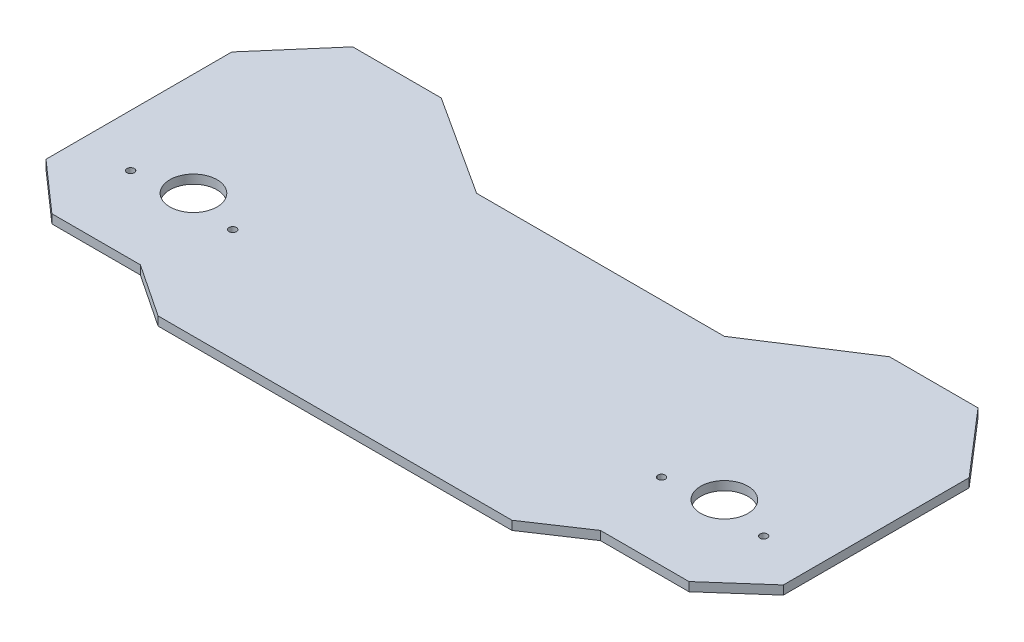
ISO-10303-21;
HEADER;
FILE_DESCRIPTION(('STEP AP214'),'2;1');
FILE_NAME('part.step','',(''),(''),'','','');
FILE_SCHEMA(('AUTOMOTIVE_DESIGN { 1 0 10303 214 1 1 1 1 }'));
ENDSEC;
DATA;
#1=APPLICATION_CONTEXT('core data for automotive mechanical design processes');
#2=APPLICATION_PROTOCOL_DEFINITION('international standard','automotive_design',2000,#1);
#3=PRODUCT_CONTEXT('',#1,'mechanical');
#4=PRODUCT('Part','Part','',(#3));
#5=PRODUCT_RELATED_PRODUCT_CATEGORY('part','',(#4));
#6=PRODUCT_DEFINITION_FORMATION('','',#4);
#7=PRODUCT_DEFINITION_CONTEXT('part definition',#1,'design');
#8=PRODUCT_DEFINITION('design','',#6,#7);
#9=PRODUCT_DEFINITION_SHAPE('','',#8);
#10=(LENGTH_UNIT() NAMED_UNIT(*) SI_UNIT(.MILLI.,.METRE.));
#11=(NAMED_UNIT(*) PLANE_ANGLE_UNIT() SI_UNIT($,.RADIAN.));
#12=(NAMED_UNIT(*) SI_UNIT($,.STERADIAN.) SOLID_ANGLE_UNIT());
#13=UNCERTAINTY_MEASURE_WITH_UNIT(LENGTH_MEASURE(1.E-05),#10,'distance_accuracy_value','');
#14=(GEOMETRIC_REPRESENTATION_CONTEXT(3) GLOBAL_UNCERTAINTY_ASSIGNED_CONTEXT((#13)) GLOBAL_UNIT_ASSIGNED_CONTEXT((#10,
#11,#12)) REPRESENTATION_CONTEXT('',''));
#15=CARTESIAN_POINT('',(0.,0.,0.));
#16=DIRECTION('',(0.,0.,1.));
#17=DIRECTION('',(1.,0.,0.));
#18=AXIS2_PLACEMENT_3D('',#15,#16,#17);
#19=CARTESIAN_POINT('',(0.,3.,0.));
#20=DIRECTION('',(0.,1.,0.));
#21=DIRECTION('',(0.,0.,1.));
#22=AXIS2_PLACEMENT_3D('',#19,#20,#21);
#23=PLANE('',#22);
#24=CARTESIAN_POINT('',(72.7,3.,6.99999999999998));
#25=DIRECTION('',(0.,1.,0.));
#26=DIRECTION('',(0.,0.,1.));
#27=AXIS2_PLACEMENT_3D('',#24,#25,#26);
#28=CIRCLE('',#27,1.25);
#29=CARTESIAN_POINT('',(72.7,3.,8.24999999999998));
#30=VERTEX_POINT('',#29);
#31=EDGE_CURVE('E352',#30,#30,#28,.T.);
#32=ORIENTED_EDGE('',*,*,#31,.F.);
#33=EDGE_LOOP('',(#32));
#34=FACE_BOUND('',#33,.T.);
#35=CARTESIAN_POINT('',(-72.7,3.,6.99999999999998));
#36=DIRECTION('',(0.,1.,0.));
#37=DIRECTION('',(0.,0.,1.));
#38=AXIS2_PLACEMENT_3D('',#35,#36,#37);
#39=CIRCLE('',#38,1.25);
#40=CARTESIAN_POINT('',(-72.7,3.,8.24999999999998));
#41=VERTEX_POINT('',#40);
#42=EDGE_CURVE('E364',#41,#41,#39,.T.);
#43=ORIENTED_EDGE('',*,*,#42,.F.);
#44=EDGE_LOOP('',(#43));
#45=FACE_BOUND('',#44,.T.);
#46=CARTESIAN_POINT('',(-90.,3.,2.99999999999998));
#47=DIRECTION('',(0.,1.,0.));
#48=DIRECTION('',(0.,0.,1.));
#49=AXIS2_PLACEMENT_3D('',#46,#47,#48);
#50=CIRCLE('',#49,8.00000000000001);
#51=CARTESIAN_POINT('',(-90.,3.,11.));
#52=VERTEX_POINT('',#51);
#53=EDGE_CURVE('E183',#52,#52,#50,.T.);
#54=ORIENTED_EDGE('',*,*,#53,.F.);
#55=EDGE_LOOP('',(#54));
#56=FACE_BOUND('',#55,.T.);
#57=DIRECTION('',(-0.839570157152151,0.,-0.543251278157274));
#58=VECTOR('',#57,1.);
#59=CARTESIAN_POINT('',(-76.,3.,-67.));
#60=LINE('',#59,#58);
#61=CARTESIAN_POINT('',(-42.,3.,-45.));
#62=VERTEX_POINT('',#61);
#63=CARTESIAN_POINT('',(-76.,3.,-67.));
#64=VERTEX_POINT('',#63);
#65=EDGE_CURVE('E210',#62,#64,#60,.T.);
#66=ORIENTED_EDGE('',*,*,#65,.T.);
#67=DIRECTION('',(-1.,0.,0.));
#68=VECTOR('',#67,1.);
#69=CARTESIAN_POINT('',(-106.,3.,-67.));
#70=LINE('',#69,#68);
#71=CARTESIAN_POINT('',(-106.,3.,-67.));
#72=VERTEX_POINT('',#71);
#73=EDGE_CURVE('E118',#64,#72,#70,.T.);
#74=ORIENTED_EDGE('',*,*,#73,.T.);
#75=DIRECTION('',(-0.653619870346092,0.,0.75682300776916));
#76=VECTOR('',#75,1.);
#77=CARTESIAN_POINT('',(-125.,3.,-45.));
#78=LINE('',#77,#76);
#79=CARTESIAN_POINT('',(-125.,3.,-45.));
#80=VERTEX_POINT('',#79);
#81=EDGE_CURVE('E249',#72,#80,#78,.T.);
#82=ORIENTED_EDGE('',*,*,#81,.T.);
#83=DIRECTION('',(0.,0.,1.));
#84=VECTOR('',#83,1.);
#85=CARTESIAN_POINT('',(-125.,3.,18.));
#86=LINE('',#85,#84);
#87=CARTESIAN_POINT('',(-125.,3.,18.));
#88=VERTEX_POINT('',#87);
#89=EDGE_CURVE('E268',#80,#88,#86,.T.);
#90=ORIENTED_EDGE('',*,*,#89,.T.);
#91=DIRECTION('',(0.749837855365093,0.,0.661621637086846));
#92=VECTOR('',#91,1.);
#93=CARTESIAN_POINT('',(-108.,3.,33.));
#94=LINE('',#93,#92);
#95=CARTESIAN_POINT('',(-108.,3.,33.));
#96=VERTEX_POINT('',#95);
#97=EDGE_CURVE('E265',#88,#96,#94,.T.);
#98=ORIENTED_EDGE('',*,*,#97,.T.);
#99=DIRECTION('',(1.,0.,0.));
#100=VECTOR('',#99,1.);
#101=CARTESIAN_POINT('',(-78.,3.,33.));
#102=LINE('',#101,#100);
#103=CARTESIAN_POINT('',(-78.,3.,33.));
#104=VERTEX_POINT('',#103);
#105=EDGE_CURVE('E267',#96,#104,#102,.T.);
#106=ORIENTED_EDGE('',*,*,#105,.T.);
#107=DIRECTION('',(0.832050294337843,0.,0.55470019622523));
#108=VECTOR('',#107,1.);
#109=CARTESIAN_POINT('',(-60.,3.,45.));
#110=LINE('',#109,#108);
#111=CARTESIAN_POINT('',(-60.,3.,45.));
#112=VERTEX_POINT('',#111);
#113=EDGE_CURVE('E270',#104,#112,#110,.T.);
#114=ORIENTED_EDGE('',*,*,#113,.T.);
#115=DIRECTION('',(1.,0.,0.));
#116=VECTOR('',#115,1.);
#117=CARTESIAN_POINT('',(60.,3.,45.));
#118=LINE('',#117,#116);
#119=CARTESIAN_POINT('',(60.,3.,45.));
#120=VERTEX_POINT('',#119);
#121=EDGE_CURVE('E276',#112,#120,#118,.T.);
#122=ORIENTED_EDGE('',*,*,#121,.T.);
#123=DIRECTION('',(0.832050294337843,0.,-0.55470019622523));
#124=VECTOR('',#123,1.);
#125=CARTESIAN_POINT('',(78.,3.,33.));
#126=LINE('',#125,#124);
#127=CARTESIAN_POINT('',(78.,3.,33.));
#128=VERTEX_POINT('',#127);
#129=EDGE_CURVE('E278',#120,#128,#126,.T.);
#130=ORIENTED_EDGE('',*,*,#129,.T.);
#131=DIRECTION('',(1.,0.,0.));
#132=VECTOR('',#131,1.);
#133=CARTESIAN_POINT('',(108.,3.,33.));
#134=LINE('',#133,#132);
#135=CARTESIAN_POINT('',(108.,3.,33.));
#136=VERTEX_POINT('',#135);
#137=EDGE_CURVE('E280',#128,#136,#134,.T.);
#138=ORIENTED_EDGE('',*,*,#137,.T.);
#139=DIRECTION('',(0.749837855365093,0.,-0.661621637086846));
#140=VECTOR('',#139,1.);
#141=CARTESIAN_POINT('',(125.,3.,18.));
#142=LINE('',#141,#140);
#143=CARTESIAN_POINT('',(125.,3.,18.));
#144=VERTEX_POINT('',#143);
#145=EDGE_CURVE('E282',#136,#144,#142,.T.);
#146=ORIENTED_EDGE('',*,*,#145,.T.);
#147=DIRECTION('',(0.,0.,-1.));
#148=VECTOR('',#147,1.);
#149=CARTESIAN_POINT('',(125.,3.,-45.));
#150=LINE('',#149,#148);
#151=CARTESIAN_POINT('',(125.,3.,-45.));
#152=VERTEX_POINT('',#151);
#153=EDGE_CURVE('E284',#144,#152,#150,.T.);
#154=ORIENTED_EDGE('',*,*,#153,.T.);
#155=DIRECTION('',(-0.653619870346092,0.,-0.75682300776916));
#156=VECTOR('',#155,1.);
#157=CARTESIAN_POINT('',(106.,3.,-67.));
#158=LINE('',#157,#156);
#159=CARTESIAN_POINT('',(106.,3.,-67.));
#160=VERTEX_POINT('',#159);
#161=EDGE_CURVE('E161',#152,#160,#158,.T.);
#162=ORIENTED_EDGE('',*,*,#161,.T.);
#163=DIRECTION('',(-1.,0.,0.));
#164=VECTOR('',#163,1.);
#165=CARTESIAN_POINT('',(76.,3.,-67.));
#166=LINE('',#165,#164);
#167=CARTESIAN_POINT('',(76.,3.,-67.));
#168=VERTEX_POINT('',#167);
#169=EDGE_CURVE('E155',#160,#168,#166,.T.);
#170=ORIENTED_EDGE('',*,*,#169,.T.);
#171=DIRECTION('',(-0.839570157152151,0.,0.543251278157274));
#172=VECTOR('',#171,1.);
#173=CARTESIAN_POINT('',(42.,3.,-45.));
#174=LINE('',#173,#172);
#175=CARTESIAN_POINT('',(42.,3.,-45.));
#176=VERTEX_POINT('',#175);
#177=EDGE_CURVE('E159',#168,#176,#174,.T.);
#178=ORIENTED_EDGE('',*,*,#177,.T.);
#179=DIRECTION('',(-1.,0.,0.));
#180=VECTOR('',#179,1.);
#181=CARTESIAN_POINT('',(-42.,3.,-45.));
#182=LINE('',#181,#180);
#183=EDGE_CURVE('E51',#176,#62,#182,.T.);
#184=ORIENTED_EDGE('',*,*,#183,.T.);
#185=EDGE_LOOP('',(#66,#74,#82,#90,#98,#106,#114,#122,#130,#138,#146,#154,#162,#170,#178,#184));
#186=FACE_BOUND('',#185,.T.);
#187=CARTESIAN_POINT('',(90.,3.,2.99999999999998));
#188=DIRECTION('',(0.,1.,0.));
#189=DIRECTION('',(0.,0.,1.));
#190=AXIS2_PLACEMENT_3D('',#187,#188,#189);
#191=CIRCLE('',#190,8.00000000000001);
#192=CARTESIAN_POINT('',(90.,3.,11.));
#193=VERTEX_POINT('',#192);
#194=EDGE_CURVE('E370',#193,#193,#191,.T.);
#195=ORIENTED_EDGE('',*,*,#194,.F.);
#196=EDGE_LOOP('',(#195));
#197=FACE_BOUND('',#196,.T.);
#198=CARTESIAN_POINT('',(-107.3,3.,6.99999999999998));
#199=DIRECTION('',(0.,1.,0.));
#200=DIRECTION('',(0.,0.,1.));
#201=AXIS2_PLACEMENT_3D('',#198,#199,#200);
#202=CIRCLE('',#201,1.25);
#203=CARTESIAN_POINT('',(-107.3,3.,8.24999999999998));
#204=VERTEX_POINT('',#203);
#205=EDGE_CURVE('E358',#204,#204,#202,.T.);
#206=ORIENTED_EDGE('',*,*,#205,.F.);
#207=EDGE_LOOP('',(#206));
#208=FACE_BOUND('',#207,.T.);
#209=CARTESIAN_POINT('',(107.3,3.,6.99999999999998));
#210=DIRECTION('',(0.,1.,0.));
#211=DIRECTION('',(0.,0.,1.));
#212=AXIS2_PLACEMENT_3D('',#209,#210,#211);
#213=CIRCLE('',#212,1.25);
#214=CARTESIAN_POINT('',(107.3,3.,8.24999999999998));
#215=VERTEX_POINT('',#214);
#216=EDGE_CURVE('E343',#215,#215,#213,.T.);
#217=ORIENTED_EDGE('',*,*,#216,.F.);
#218=EDGE_LOOP('',(#217));
#219=FACE_BOUND('',#218,.T.);
#220=ADVANCED_FACE('F34',(#34,#45,#56,#186,#197,#208,#219),#23,.T.);
#221=CARTESIAN_POINT('',(0.,0.,0.));
#222=DIRECTION('',(0.,1.,0.));
#223=DIRECTION('',(0.,0.,1.));
#224=AXIS2_PLACEMENT_3D('',#221,#222,#223);
#225=PLANE('',#224);
#226=DIRECTION('',(-0.839570157152151,0.,-0.543251278157274));
#227=VECTOR('',#226,1.);
#228=CARTESIAN_POINT('',(-76.,0.,-67.));
#229=LINE('',#228,#227);
#230=CARTESIAN_POINT('',(-42.,0.,-45.));
#231=VERTEX_POINT('',#230);
#232=CARTESIAN_POINT('',(-76.,0.,-67.));
#233=VERTEX_POINT('',#232);
#234=EDGE_CURVE('E179',#231,#233,#229,.T.);
#235=ORIENTED_EDGE('',*,*,#234,.F.);
#236=DIRECTION('',(-1.,0.,0.));
#237=VECTOR('',#236,1.);
#238=CARTESIAN_POINT('',(-42.,0.,-45.));
#239=LINE('',#238,#237);
#240=CARTESIAN_POINT('',(42.,0.,-45.));
#241=VERTEX_POINT('',#240);
#242=EDGE_CURVE('E110',#241,#231,#239,.T.);
#243=ORIENTED_EDGE('',*,*,#242,.F.);
#244=DIRECTION('',(-0.839570157152151,0.,0.543251278157274));
#245=VECTOR('',#244,1.);
#246=CARTESIAN_POINT('',(42.,0.,-45.));
#247=LINE('',#246,#245);
#248=CARTESIAN_POINT('',(76.,0.,-67.));
#249=VERTEX_POINT('',#248);
#250=EDGE_CURVE('E104',#249,#241,#247,.T.);
#251=ORIENTED_EDGE('',*,*,#250,.F.);
#252=DIRECTION('',(-1.,0.,0.));
#253=VECTOR('',#252,1.);
#254=CARTESIAN_POINT('',(76.,0.,-67.));
#255=LINE('',#254,#253);
#256=CARTESIAN_POINT('',(106.,0.,-67.));
#257=VERTEX_POINT('',#256);
#258=EDGE_CURVE('E169',#257,#249,#255,.T.);
#259=ORIENTED_EDGE('',*,*,#258,.F.);
#260=DIRECTION('',(-0.653619870346092,0.,-0.75682300776916));
#261=VECTOR('',#260,1.);
#262=CARTESIAN_POINT('',(106.,0.,-67.));
#263=LINE('',#262,#261);
#264=CARTESIAN_POINT('',(125.,0.,-45.));
#265=VERTEX_POINT('',#264);
#266=EDGE_CURVE('E205',#265,#257,#263,.T.);
#267=ORIENTED_EDGE('',*,*,#266,.F.);
#268=DIRECTION('',(0.,0.,-1.));
#269=VECTOR('',#268,1.);
#270=CARTESIAN_POINT('',(125.,0.,-45.));
#271=LINE('',#270,#269);
#272=CARTESIAN_POINT('',(125.,0.,18.));
#273=VERTEX_POINT('',#272);
#274=EDGE_CURVE('E203',#273,#265,#271,.T.);
#275=ORIENTED_EDGE('',*,*,#274,.F.);
#276=DIRECTION('',(0.749837855365093,0.,-0.661621637086846));
#277=VECTOR('',#276,1.);
#278=CARTESIAN_POINT('',(125.,0.,18.));
#279=LINE('',#278,#277);
#280=CARTESIAN_POINT('',(108.,0.,33.));
#281=VERTEX_POINT('',#280);
#282=EDGE_CURVE('E201',#281,#273,#279,.T.);
#283=ORIENTED_EDGE('',*,*,#282,.F.);
#284=DIRECTION('',(1.,0.,0.));
#285=VECTOR('',#284,1.);
#286=CARTESIAN_POINT('',(108.,0.,33.));
#287=LINE('',#286,#285);
#288=CARTESIAN_POINT('',(78.,0.,33.));
#289=VERTEX_POINT('',#288);
#290=EDGE_CURVE('E199',#289,#281,#287,.T.);
#291=ORIENTED_EDGE('',*,*,#290,.F.);
#292=DIRECTION('',(0.832050294337843,0.,-0.55470019622523));
#293=VECTOR('',#292,1.);
#294=CARTESIAN_POINT('',(78.,0.,33.));
#295=LINE('',#294,#293);
#296=CARTESIAN_POINT('',(60.,0.,45.));
#297=VERTEX_POINT('',#296);
#298=EDGE_CURVE('E197',#297,#289,#295,.T.);
#299=ORIENTED_EDGE('',*,*,#298,.F.);
#300=DIRECTION('',(1.,0.,0.));
#301=VECTOR('',#300,1.);
#302=CARTESIAN_POINT('',(60.,0.,45.));
#303=LINE('',#302,#301);
#304=CARTESIAN_POINT('',(-60.,0.,45.));
#305=VERTEX_POINT('',#304);
#306=EDGE_CURVE('E195',#305,#297,#303,.T.);
#307=ORIENTED_EDGE('',*,*,#306,.F.);
#308=DIRECTION('',(0.832050294337843,0.,0.55470019622523));
#309=VECTOR('',#308,1.);
#310=CARTESIAN_POINT('',(-60.,0.,45.));
#311=LINE('',#310,#309);
#312=CARTESIAN_POINT('',(-78.,0.,33.));
#313=VERTEX_POINT('',#312);
#314=EDGE_CURVE('E193',#313,#305,#311,.T.);
#315=ORIENTED_EDGE('',*,*,#314,.F.);
#316=DIRECTION('',(1.,0.,0.));
#317=VECTOR('',#316,1.);
#318=CARTESIAN_POINT('',(-78.,0.,33.));
#319=LINE('',#318,#317);
#320=CARTESIAN_POINT('',(-108.,0.,33.));
#321=VERTEX_POINT('',#320);
#322=EDGE_CURVE('E191',#321,#313,#319,.T.);
#323=ORIENTED_EDGE('',*,*,#322,.F.);
#324=DIRECTION('',(0.749837855365093,0.,0.661621637086846));
#325=VECTOR('',#324,1.);
#326=CARTESIAN_POINT('',(-108.,0.,33.));
#327=LINE('',#326,#325);
#328=CARTESIAN_POINT('',(-125.,0.,18.));
#329=VERTEX_POINT('',#328);
#330=EDGE_CURVE('E189',#329,#321,#327,.T.);
#331=ORIENTED_EDGE('',*,*,#330,.F.);
#332=DIRECTION('',(0.,0.,1.));
#333=VECTOR('',#332,1.);
#334=CARTESIAN_POINT('',(-125.,0.,18.));
#335=LINE('',#334,#333);
#336=CARTESIAN_POINT('',(-125.,0.,-45.));
#337=VERTEX_POINT('',#336);
#338=EDGE_CURVE('E187',#337,#329,#335,.T.);
#339=ORIENTED_EDGE('',*,*,#338,.F.);
#340=DIRECTION('',(-0.653619870346092,0.,0.75682300776916));
#341=VECTOR('',#340,1.);
#342=CARTESIAN_POINT('',(-125.,0.,-45.));
#343=LINE('',#342,#341);
#344=CARTESIAN_POINT('',(-106.,0.,-67.));
#345=VERTEX_POINT('',#344);
#346=EDGE_CURVE('E185',#345,#337,#343,.T.);
#347=ORIENTED_EDGE('',*,*,#346,.F.);
#348=DIRECTION('',(-1.,0.,0.));
#349=VECTOR('',#348,1.);
#350=CARTESIAN_POINT('',(-106.,0.,-67.));
#351=LINE('',#350,#349);
#352=EDGE_CURVE('E182',#233,#345,#351,.T.);
#353=ORIENTED_EDGE('',*,*,#352,.F.);
#354=EDGE_LOOP('',(#235,#243,#251,#259,#267,#275,#283,#291,#299,#307,#315,#323,#331,#339,#347,#353));
#355=FACE_BOUND('',#354,.T.);
#356=CARTESIAN_POINT('',(-90.,0.,2.99999999999998));
#357=DIRECTION('',(0.,1.,0.));
#358=DIRECTION('',(0.,0.,1.));
#359=AXIS2_PLACEMENT_3D('',#356,#357,#358);
#360=CIRCLE('',#359,8.00000000000001);
#361=CARTESIAN_POINT('',(-90.,0.,11.));
#362=VERTEX_POINT('',#361);
#363=EDGE_CURVE('E373',#362,#362,#360,.T.);
#364=ORIENTED_EDGE('',*,*,#363,.T.);
#365=EDGE_LOOP('',(#364));
#366=FACE_BOUND('',#365,.T.);
#367=CARTESIAN_POINT('',(90.,0.,2.99999999999998));
#368=DIRECTION('',(0.,1.,0.));
#369=DIRECTION('',(0.,0.,1.));
#370=AXIS2_PLACEMENT_3D('',#367,#368,#369);
#371=CIRCLE('',#370,8.00000000000001);
#372=CARTESIAN_POINT('',(90.,0.,11.));
#373=VERTEX_POINT('',#372);
#374=EDGE_CURVE('E367',#373,#373,#371,.T.);
#375=ORIENTED_EDGE('',*,*,#374,.T.);
#376=EDGE_LOOP('',(#375));
#377=FACE_BOUND('',#376,.T.);
#378=CARTESIAN_POINT('',(-72.7,0.,6.99999999999998));
#379=DIRECTION('',(0.,1.,0.));
#380=DIRECTION('',(0.,0.,1.));
#381=AXIS2_PLACEMENT_3D('',#378,#379,#380);
#382=CIRCLE('',#381,1.25);
#383=CARTESIAN_POINT('',(-72.7,0.,8.24999999999998));
#384=VERTEX_POINT('',#383);
#385=EDGE_CURVE('E361',#384,#384,#382,.T.);
#386=ORIENTED_EDGE('',*,*,#385,.T.);
#387=EDGE_LOOP('',(#386));
#388=FACE_BOUND('',#387,.T.);
#389=CARTESIAN_POINT('',(-107.3,0.,6.99999999999998));
#390=DIRECTION('',(0.,1.,0.));
#391=DIRECTION('',(0.,0.,1.));
#392=AXIS2_PLACEMENT_3D('',#389,#390,#391);
#393=CIRCLE('',#392,1.25);
#394=CARTESIAN_POINT('',(-107.3,0.,8.24999999999998));
#395=VERTEX_POINT('',#394);
#396=EDGE_CURVE('E355',#395,#395,#393,.T.);
#397=ORIENTED_EDGE('',*,*,#396,.T.);
#398=EDGE_LOOP('',(#397));
#399=FACE_BOUND('',#398,.T.);
#400=CARTESIAN_POINT('',(72.7,0.,6.99999999999998));
#401=DIRECTION('',(0.,1.,0.));
#402=DIRECTION('',(0.,0.,1.));
#403=AXIS2_PLACEMENT_3D('',#400,#401,#402);
#404=CIRCLE('',#403,1.25);
#405=CARTESIAN_POINT('',(72.7,0.,8.24999999999998));
#406=VERTEX_POINT('',#405);
#407=EDGE_CURVE('E349',#406,#406,#404,.T.);
#408=ORIENTED_EDGE('',*,*,#407,.T.);
#409=EDGE_LOOP('',(#408));
#410=FACE_BOUND('',#409,.T.);
#411=CARTESIAN_POINT('',(107.3,0.,6.99999999999998));
#412=DIRECTION('',(0.,1.,0.));
#413=DIRECTION('',(0.,0.,1.));
#414=AXIS2_PLACEMENT_3D('',#411,#412,#413);
#415=CIRCLE('',#414,1.25);
#416=CARTESIAN_POINT('',(107.3,0.,8.24999999999998));
#417=VERTEX_POINT('',#416);
#418=EDGE_CURVE('E346',#417,#417,#415,.T.);
#419=ORIENTED_EDGE('',*,*,#418,.T.);
#420=EDGE_LOOP('',(#419));
#421=FACE_BOUND('',#420,.T.);
#422=ADVANCED_FACE('F253',(#355,#366,#377,#388,#399,#410,#421),#225,.F.);
#423=CARTESIAN_POINT('',(-76.,3.,-67.));
#424=DIRECTION('',(-0.543251278157275,0.,0.839570157152151));
#425=DIRECTION('',(0.839570157152151,0.,0.543251278157275));
#426=AXIS2_PLACEMENT_3D('',#423,#424,#425);
#427=PLANE('',#426);
#428=ORIENTED_EDGE('',*,*,#234,.T.);
#429=DIRECTION('',(0.,-1.,0.));
#430=VECTOR('',#429,1.);
#431=CARTESIAN_POINT('',(-76.,3.,-67.));
#432=LINE('',#431,#430);
#433=EDGE_CURVE('E11',#64,#233,#432,.T.);
#434=ORIENTED_EDGE('',*,*,#433,.F.);
#435=ORIENTED_EDGE('',*,*,#65,.F.);
#436=DIRECTION('',(0.,-1.,0.));
#437=VECTOR('',#436,1.);
#438=CARTESIAN_POINT('',(-42.,3.,-45.));
#439=LINE('',#438,#437);
#440=EDGE_CURVE('E175',#62,#231,#439,.T.);
#441=ORIENTED_EDGE('',*,*,#440,.T.);
#442=EDGE_LOOP('',(#428,#434,#435,#441));
#443=FACE_BOUND('',#442,.T.);
#444=ADVANCED_FACE('F36',(#443),#427,.F.);
#445=CARTESIAN_POINT('',(-106.,3.,-67.));
#446=DIRECTION('',(0.,0.,1.));
#447=DIRECTION('',(1.,0.,0.));
#448=AXIS2_PLACEMENT_3D('',#445,#446,#447);
#449=PLANE('',#448);
#450=ORIENTED_EDGE('',*,*,#352,.T.);
#451=DIRECTION('',(0.,-1.,0.));
#452=VECTOR('',#451,1.);
#453=CARTESIAN_POINT('',(-106.,3.,-67.));
#454=LINE('',#453,#452);
#455=EDGE_CURVE('E43',#72,#345,#454,.T.);
#456=ORIENTED_EDGE('',*,*,#455,.F.);
#457=ORIENTED_EDGE('',*,*,#73,.F.);
#458=ORIENTED_EDGE('',*,*,#433,.T.);
#459=EDGE_LOOP('',(#450,#456,#457,#458));
#460=FACE_BOUND('',#459,.T.);
#461=ADVANCED_FACE('F541',(#460),#449,.F.);
#462=CARTESIAN_POINT('',(-125.,3.,-45.));
#463=DIRECTION('',(0.75682300776916,0.,0.653619870346092));
#464=DIRECTION('',(0.653619870346092,0.,-0.75682300776916));
#465=AXIS2_PLACEMENT_3D('',#462,#463,#464);
#466=PLANE('',#465);
#467=ORIENTED_EDGE('',*,*,#346,.T.);
#468=DIRECTION('',(0.,-1.,0.));
#469=VECTOR('',#468,1.);
#470=CARTESIAN_POINT('',(-125.,3.,-45.));
#471=LINE('',#470,#469);
#472=EDGE_CURVE('E241',#80,#337,#471,.T.);
#473=ORIENTED_EDGE('',*,*,#472,.F.);
#474=ORIENTED_EDGE('',*,*,#81,.F.);
#475=ORIENTED_EDGE('',*,*,#455,.T.);
#476=EDGE_LOOP('',(#467,#473,#474,#475));
#477=FACE_BOUND('',#476,.T.);
#478=ADVANCED_FACE('F247',(#477),#466,.F.);
#479=CARTESIAN_POINT('',(-125.,3.,18.));
#480=DIRECTION('',(1.,0.,0.));
#481=DIRECTION('',(0.,0.,-1.));
#482=AXIS2_PLACEMENT_3D('',#479,#480,#481);
#483=PLANE('',#482);
#484=ORIENTED_EDGE('',*,*,#338,.T.);
#485=DIRECTION('',(0.,-1.,0.));
#486=VECTOR('',#485,1.);
#487=CARTESIAN_POINT('',(-125.,3.,18.));
#488=LINE('',#487,#486);
#489=EDGE_CURVE('E238',#88,#329,#488,.T.);
#490=ORIENTED_EDGE('',*,*,#489,.F.);
#491=ORIENTED_EDGE('',*,*,#89,.F.);
#492=ORIENTED_EDGE('',*,*,#472,.T.);
#493=EDGE_LOOP('',(#484,#490,#491,#492));
#494=FACE_BOUND('',#493,.T.);
#495=ADVANCED_FACE('F259',(#494),#483,.F.);
#496=CARTESIAN_POINT('',(-108.,3.,33.));
#497=DIRECTION('',(0.661621637086846,0.,-0.749837855365093));
#498=DIRECTION('',(-0.749837855365093,0.,-0.661621637086846));
#499=AXIS2_PLACEMENT_3D('',#496,#497,#498);
#500=PLANE('',#499);
#501=ORIENTED_EDGE('',*,*,#330,.T.);
#502=DIRECTION('',(0.,-1.,0.));
#503=VECTOR('',#502,1.);
#504=CARTESIAN_POINT('',(-108.,3.,33.));
#505=LINE('',#504,#503);
#506=EDGE_CURVE('E235',#96,#321,#505,.T.);
#507=ORIENTED_EDGE('',*,*,#506,.F.);
#508=ORIENTED_EDGE('',*,*,#97,.F.);
#509=ORIENTED_EDGE('',*,*,#489,.T.);
#510=EDGE_LOOP('',(#501,#507,#508,#509));
#511=FACE_BOUND('',#510,.T.);
#512=ADVANCED_FACE('F263',(#511),#500,.F.);
#513=CARTESIAN_POINT('',(-78.,3.,33.));
#514=DIRECTION('',(0.,0.,-1.));
#515=DIRECTION('',(-1.,0.,0.));
#516=AXIS2_PLACEMENT_3D('',#513,#514,#515);
#517=PLANE('',#516);
#518=ORIENTED_EDGE('',*,*,#322,.T.);
#519=DIRECTION('',(0.,-1.,0.));
#520=VECTOR('',#519,1.);
#521=CARTESIAN_POINT('',(-78.,3.,33.));
#522=LINE('',#521,#520);
#523=EDGE_CURVE('E232',#104,#313,#522,.T.);
#524=ORIENTED_EDGE('',*,*,#523,.F.);
#525=ORIENTED_EDGE('',*,*,#105,.F.);
#526=ORIENTED_EDGE('',*,*,#506,.T.);
#527=EDGE_LOOP('',(#518,#524,#525,#526));
#528=FACE_BOUND('',#527,.T.);
#529=ADVANCED_FACE('F506',(#528),#517,.F.);
#530=CARTESIAN_POINT('',(-60.,3.,45.));
#531=DIRECTION('',(0.55470019622523,0.,-0.832050294337843));
#532=DIRECTION('',(-0.832050294337843,0.,-0.55470019622523));
#533=AXIS2_PLACEMENT_3D('',#530,#531,#532);
#534=PLANE('',#533);
#535=ORIENTED_EDGE('',*,*,#314,.T.);
#536=DIRECTION('',(0.,-1.,0.));
#537=VECTOR('',#536,1.);
#538=CARTESIAN_POINT('',(-60.,3.,45.));
#539=LINE('',#538,#537);
#540=EDGE_CURVE('E229',#112,#305,#539,.T.);
#541=ORIENTED_EDGE('',*,*,#540,.F.);
#542=ORIENTED_EDGE('',*,*,#113,.F.);
#543=ORIENTED_EDGE('',*,*,#523,.T.);
#544=EDGE_LOOP('',(#535,#541,#542,#543));
#545=FACE_BOUND('',#544,.T.);
#546=ADVANCED_FACE('F496',(#545),#534,.F.);
#547=CARTESIAN_POINT('',(60.,3.,45.));
#548=DIRECTION('',(0.,0.,-1.));
#549=DIRECTION('',(-1.,0.,0.));
#550=AXIS2_PLACEMENT_3D('',#547,#548,#549);
#551=PLANE('',#550);
#552=ORIENTED_EDGE('',*,*,#306,.T.);
#553=DIRECTION('',(0.,-1.,0.));
#554=VECTOR('',#553,1.);
#555=CARTESIAN_POINT('',(60.,3.,45.));
#556=LINE('',#555,#554);
#557=EDGE_CURVE('E226',#120,#297,#556,.T.);
#558=ORIENTED_EDGE('',*,*,#557,.F.);
#559=ORIENTED_EDGE('',*,*,#121,.F.);
#560=ORIENTED_EDGE('',*,*,#540,.T.);
#561=EDGE_LOOP('',(#552,#558,#559,#560));
#562=FACE_BOUND('',#561,.T.);
#563=ADVANCED_FACE('F486',(#562),#551,.F.);
#564=CARTESIAN_POINT('',(78.,3.,33.));
#565=DIRECTION('',(-0.55470019622523,0.,-0.832050294337843));
#566=DIRECTION('',(-0.832050294337843,0.,0.55470019622523));
#567=AXIS2_PLACEMENT_3D('',#564,#565,#566);
#568=PLANE('',#567);
#569=ORIENTED_EDGE('',*,*,#298,.T.);
#570=DIRECTION('',(0.,-1.,0.));
#571=VECTOR('',#570,1.);
#572=CARTESIAN_POINT('',(78.,3.,33.));
#573=LINE('',#572,#571);
#574=EDGE_CURVE('E223',#128,#289,#573,.T.);
#575=ORIENTED_EDGE('',*,*,#574,.F.);
#576=ORIENTED_EDGE('',*,*,#129,.F.);
#577=ORIENTED_EDGE('',*,*,#557,.T.);
#578=EDGE_LOOP('',(#569,#575,#576,#577));
#579=FACE_BOUND('',#578,.T.);
#580=ADVANCED_FACE('F476',(#579),#568,.F.);
#581=CARTESIAN_POINT('',(108.,3.,33.));
#582=DIRECTION('',(0.,0.,-1.));
#583=DIRECTION('',(-1.,0.,0.));
#584=AXIS2_PLACEMENT_3D('',#581,#582,#583);
#585=PLANE('',#584);
#586=ORIENTED_EDGE('',*,*,#290,.T.);
#587=DIRECTION('',(0.,-1.,0.));
#588=VECTOR('',#587,1.);
#589=CARTESIAN_POINT('',(108.,3.,33.));
#590=LINE('',#589,#588);
#591=EDGE_CURVE('E220',#136,#281,#590,.T.);
#592=ORIENTED_EDGE('',*,*,#591,.F.);
#593=ORIENTED_EDGE('',*,*,#137,.F.);
#594=ORIENTED_EDGE('',*,*,#574,.T.);
#595=EDGE_LOOP('',(#586,#592,#593,#594));
#596=FACE_BOUND('',#595,.T.);
#597=ADVANCED_FACE('F466',(#596),#585,.F.);
#598=CARTESIAN_POINT('',(125.,3.,18.));
#599=DIRECTION('',(-0.661621637086845,0.,-0.749837855365093));
#600=DIRECTION('',(-0.749837855365093,0.,0.661621637086845));
#601=AXIS2_PLACEMENT_3D('',#598,#599,#600);
#602=PLANE('',#601);
#603=ORIENTED_EDGE('',*,*,#282,.T.);
#604=DIRECTION('',(0.,-1.,0.));
#605=VECTOR('',#604,1.);
#606=CARTESIAN_POINT('',(125.,3.,18.));
#607=LINE('',#606,#605);
#608=EDGE_CURVE('E217',#144,#273,#607,.T.);
#609=ORIENTED_EDGE('',*,*,#608,.F.);
#610=ORIENTED_EDGE('',*,*,#145,.F.);
#611=ORIENTED_EDGE('',*,*,#591,.T.);
#612=EDGE_LOOP('',(#603,#609,#610,#611));
#613=FACE_BOUND('',#612,.T.);
#614=ADVANCED_FACE('F457',(#613),#602,.F.);
#615=CARTESIAN_POINT('',(125.,3.,-45.));
#616=DIRECTION('',(-1.,0.,0.));
#617=DIRECTION('',(0.,0.,1.));
#618=AXIS2_PLACEMENT_3D('',#615,#616,#617);
#619=PLANE('',#618);
#620=ORIENTED_EDGE('',*,*,#274,.T.);
#621=DIRECTION('',(0.,-1.,0.));
#622=VECTOR('',#621,1.);
#623=CARTESIAN_POINT('',(125.,3.,-45.));
#624=LINE('',#623,#622);
#625=EDGE_CURVE('E214',#152,#265,#624,.T.);
#626=ORIENTED_EDGE('',*,*,#625,.F.);
#627=ORIENTED_EDGE('',*,*,#153,.F.);
#628=ORIENTED_EDGE('',*,*,#608,.T.);
#629=EDGE_LOOP('',(#620,#626,#627,#628));
#630=FACE_BOUND('',#629,.T.);
#631=ADVANCED_FACE('F290',(#630),#619,.F.);
#632=CARTESIAN_POINT('',(106.,3.,-67.));
#633=DIRECTION('',(-0.75682300776916,0.,0.653619870346092));
#634=DIRECTION('',(0.653619870346092,0.,0.75682300776916));
#635=AXIS2_PLACEMENT_3D('',#632,#633,#634);
#636=PLANE('',#635);
#637=ORIENTED_EDGE('',*,*,#266,.T.);
#638=DIRECTION('',(0.,-1.,0.));
#639=VECTOR('',#638,1.);
#640=CARTESIAN_POINT('',(106.,3.,-67.));
#641=LINE('',#640,#639);
#642=EDGE_CURVE('E170',#160,#257,#641,.T.);
#643=ORIENTED_EDGE('',*,*,#642,.F.);
#644=ORIENTED_EDGE('',*,*,#161,.F.);
#645=ORIENTED_EDGE('',*,*,#625,.T.);
#646=EDGE_LOOP('',(#637,#643,#644,#645));
#647=FACE_BOUND('',#646,.T.);
#648=ADVANCED_FACE('F294',(#647),#636,.F.);
#649=CARTESIAN_POINT('',(76.,3.,-67.));
#650=DIRECTION('',(0.,0.,1.));
#651=DIRECTION('',(1.,0.,0.));
#652=AXIS2_PLACEMENT_3D('',#649,#650,#651);
#653=PLANE('',#652);
#654=ORIENTED_EDGE('',*,*,#258,.T.);
#655=DIRECTION('',(0.,-1.,0.));
#656=VECTOR('',#655,1.);
#657=CARTESIAN_POINT('',(76.,3.,-67.));
#658=LINE('',#657,#656);
#659=EDGE_CURVE('E166',#168,#249,#658,.T.);
#660=ORIENTED_EDGE('',*,*,#659,.F.);
#661=ORIENTED_EDGE('',*,*,#169,.F.);
#662=ORIENTED_EDGE('',*,*,#642,.T.);
#663=EDGE_LOOP('',(#654,#660,#661,#662));
#664=FACE_BOUND('',#663,.T.);
#665=ADVANCED_FACE('F167',(#664),#653,.F.);
#666=CARTESIAN_POINT('',(42.,3.,-45.));
#667=DIRECTION('',(0.543251278157274,0.,0.839570157152151));
#668=DIRECTION('',(0.839570157152151,0.,-0.543251278157274));
#669=AXIS2_PLACEMENT_3D('',#666,#667,#668);
#670=PLANE('',#669);
#671=ORIENTED_EDGE('',*,*,#250,.T.);
#672=DIRECTION('',(0.,-1.,0.));
#673=VECTOR('',#672,1.);
#674=CARTESIAN_POINT('',(42.,3.,-45.));
#675=LINE('',#674,#673);
#676=EDGE_CURVE('E171',#176,#241,#675,.T.);
#677=ORIENTED_EDGE('',*,*,#676,.F.);
#678=ORIENTED_EDGE('',*,*,#177,.F.);
#679=ORIENTED_EDGE('',*,*,#659,.T.);
#680=EDGE_LOOP('',(#671,#677,#678,#679));
#681=FACE_BOUND('',#680,.T.);
#682=ADVANCED_FACE('F173',(#681),#670,.F.);
#683=CARTESIAN_POINT('',(-42.,3.,-45.));
#684=DIRECTION('',(0.,0.,1.));
#685=DIRECTION('',(1.,0.,0.));
#686=AXIS2_PLACEMENT_3D('',#683,#684,#685);
#687=PLANE('',#686);
#688=ORIENTED_EDGE('',*,*,#242,.T.);
#689=ORIENTED_EDGE('',*,*,#440,.F.);
#690=ORIENTED_EDGE('',*,*,#183,.F.);
#691=ORIENTED_EDGE('',*,*,#676,.T.);
#692=EDGE_LOOP('',(#688,#689,#690,#691));
#693=FACE_BOUND('',#692,.T.);
#694=ADVANCED_FACE('F298',(#693),#687,.F.);
#695=CARTESIAN_POINT('',(-90.,3.,2.99999999999998));
#696=DIRECTION('',(0.,-1.,0.));
#697=DIRECTION('',(0.,0.,-1.));
#698=AXIS2_PLACEMENT_3D('',#695,#696,#697);
#699=CYLINDRICAL_SURFACE('',#698,8.00000000000001);
#700=ORIENTED_EDGE('',*,*,#53,.T.);
#701=EDGE_LOOP('',(#700));
#702=FACE_BOUND('',#701,.T.);
#703=ORIENTED_EDGE('',*,*,#363,.F.);
#704=EDGE_LOOP('',(#703));
#705=FACE_BOUND('',#704,.T.);
#706=ADVANCED_FACE('F300',(#702,#705),#699,.F.);
#707=CARTESIAN_POINT('',(90.,3.,2.99999999999998));
#708=DIRECTION('',(0.,-1.,0.));
#709=DIRECTION('',(0.,0.,-1.));
#710=AXIS2_PLACEMENT_3D('',#707,#708,#709);
#711=CYLINDRICAL_SURFACE('',#710,8.00000000000001);
#712=ORIENTED_EDGE('',*,*,#194,.T.);
#713=EDGE_LOOP('',(#712));
#714=FACE_BOUND('',#713,.T.);
#715=ORIENTED_EDGE('',*,*,#374,.F.);
#716=EDGE_LOOP('',(#715));
#717=FACE_BOUND('',#716,.T.);
#718=ADVANCED_FACE('F306',(#714,#717),#711,.F.);
#719=CARTESIAN_POINT('',(-72.7,3.,6.99999999999998));
#720=DIRECTION('',(0.,-1.,0.));
#721=DIRECTION('',(0.,0.,-1.));
#722=AXIS2_PLACEMENT_3D('',#719,#720,#721);
#723=CYLINDRICAL_SURFACE('',#722,1.25);
#724=ORIENTED_EDGE('',*,*,#42,.T.);
#725=EDGE_LOOP('',(#724));
#726=FACE_BOUND('',#725,.T.);
#727=ORIENTED_EDGE('',*,*,#385,.F.);
#728=EDGE_LOOP('',(#727));
#729=FACE_BOUND('',#728,.T.);
#730=ADVANCED_FACE('F322',(#726,#729),#723,.F.);
#731=CARTESIAN_POINT('',(-107.3,3.,6.99999999999998));
#732=DIRECTION('',(0.,-1.,0.));
#733=DIRECTION('',(0.,0.,-1.));
#734=AXIS2_PLACEMENT_3D('',#731,#732,#733);
#735=CYLINDRICAL_SURFACE('',#734,1.25);
#736=ORIENTED_EDGE('',*,*,#205,.T.);
#737=EDGE_LOOP('',(#736));
#738=FACE_BOUND('',#737,.T.);
#739=ORIENTED_EDGE('',*,*,#396,.F.);
#740=EDGE_LOOP('',(#739));
#741=FACE_BOUND('',#740,.T.);
#742=ADVANCED_FACE('F326',(#738,#741),#735,.F.);
#743=CARTESIAN_POINT('',(72.7,3.,6.99999999999998));
#744=DIRECTION('',(0.,-1.,0.));
#745=DIRECTION('',(0.,0.,-1.));
#746=AXIS2_PLACEMENT_3D('',#743,#744,#745);
#747=CYLINDRICAL_SURFACE('',#746,1.25);
#748=ORIENTED_EDGE('',*,*,#31,.T.);
#749=EDGE_LOOP('',(#748));
#750=FACE_BOUND('',#749,.T.);
#751=ORIENTED_EDGE('',*,*,#407,.F.);
#752=EDGE_LOOP('',(#751));
#753=FACE_BOUND('',#752,.T.);
#754=ADVANCED_FACE('F330',(#750,#753),#747,.F.);
#755=CARTESIAN_POINT('',(107.3,3.,6.99999999999998));
#756=DIRECTION('',(0.,-1.,0.));
#757=DIRECTION('',(0.,0.,-1.));
#758=AXIS2_PLACEMENT_3D('',#755,#756,#757);
#759=CYLINDRICAL_SURFACE('',#758,1.25);
#760=ORIENTED_EDGE('',*,*,#216,.T.);
#761=EDGE_LOOP('',(#760));
#762=FACE_BOUND('',#761,.T.);
#763=ORIENTED_EDGE('',*,*,#418,.F.);
#764=EDGE_LOOP('',(#763));
#765=FACE_BOUND('',#764,.T.);
#766=ADVANCED_FACE('F334',(#762,#765),#759,.F.);
#767=CLOSED_SHELL('',(#220,#422,#444,#461,#478,#495,#512,#529,#546,#563,#580,#597,#614,#631,
#648,#665,#682,#694,#706,#718,#730,#742,#754,#766));
#768=MANIFOLD_SOLID_BREP('B2',#767);
#769=ADVANCED_BREP_SHAPE_REPRESENTATION('',(#18,#768),#14);
#770=SHAPE_DEFINITION_REPRESENTATION(#9,#769);
ENDSEC;
END-ISO-10303-21;
